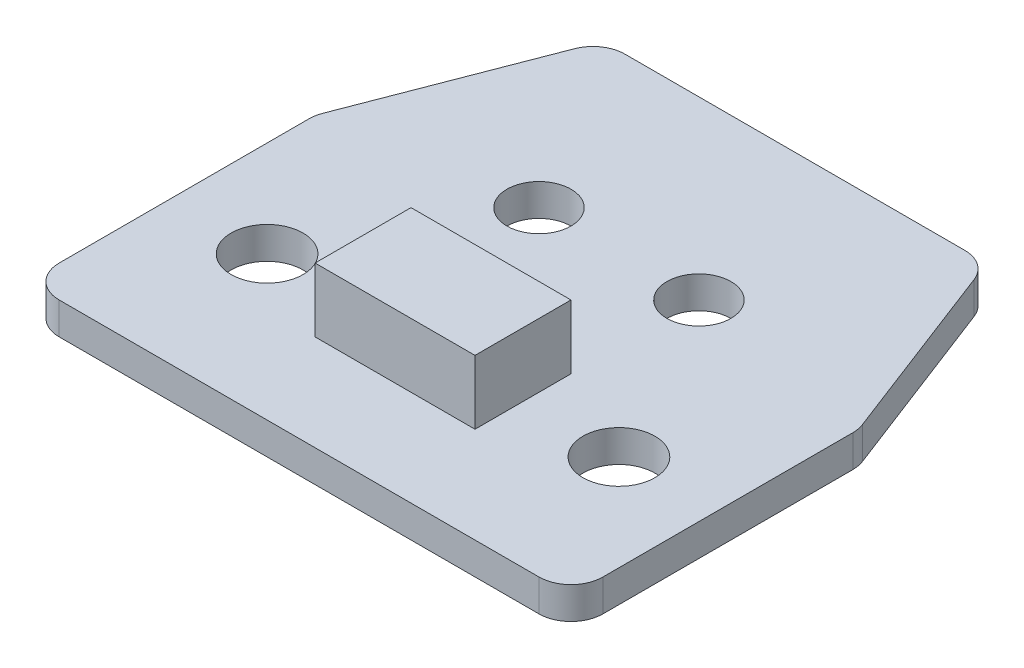
ISO-10303-21;
HEADER;
FILE_DESCRIPTION(('STEP AP214'),'2;1');
FILE_NAME('part.step','',(''),(''),'','','');
FILE_SCHEMA(('AUTOMOTIVE_DESIGN { 1 0 10303 214 1 1 1 1 }'));
ENDSEC;
DATA;
#1=APPLICATION_CONTEXT('core data for automotive mechanical design processes');
#2=APPLICATION_PROTOCOL_DEFINITION('international standard','automotive_design',2000,#1);
#3=PRODUCT_CONTEXT('',#1,'mechanical');
#4=PRODUCT('Part','Part','',(#3));
#5=PRODUCT_RELATED_PRODUCT_CATEGORY('part','',(#4));
#6=PRODUCT_DEFINITION_FORMATION('','',#4);
#7=PRODUCT_DEFINITION_CONTEXT('part definition',#1,'design');
#8=PRODUCT_DEFINITION('design','',#6,#7);
#9=PRODUCT_DEFINITION_SHAPE('','',#8);
#10=(LENGTH_UNIT() NAMED_UNIT(*) SI_UNIT(.MILLI.,.METRE.));
#11=(NAMED_UNIT(*) PLANE_ANGLE_UNIT() SI_UNIT($,.RADIAN.));
#12=(NAMED_UNIT(*) SI_UNIT($,.STERADIAN.) SOLID_ANGLE_UNIT());
#13=UNCERTAINTY_MEASURE_WITH_UNIT(LENGTH_MEASURE(1.E-05),#10,'distance_accuracy_value','');
#14=(GEOMETRIC_REPRESENTATION_CONTEXT(3) GLOBAL_UNCERTAINTY_ASSIGNED_CONTEXT((#13)) GLOBAL_UNIT_ASSIGNED_CONTEXT((#10,
#11,#12)) REPRESENTATION_CONTEXT('',''));
#15=CARTESIAN_POINT('',(0.,0.,0.));
#16=DIRECTION('',(0.,0.,1.));
#17=DIRECTION('',(1.,0.,0.));
#18=AXIS2_PLACEMENT_3D('',#15,#16,#17);
#19=CARTESIAN_POINT('',(0.,2.,0.));
#20=DIRECTION('',(0.,1.,0.));
#21=DIRECTION('',(0.,0.,1.));
#22=AXIS2_PLACEMENT_3D('',#19,#20,#21);
#23=PLANE('',#22);
#24=CARTESIAN_POINT('',(22.,2.,-20.));
#25=DIRECTION('',(0.,1.,0.));
#26=DIRECTION('',(0.,0.,1.));
#27=AXIS2_PLACEMENT_3D('',#24,#25,#26);
#28=CIRCLE('',#27,2.);
#29=CARTESIAN_POINT('',(22.,2.,-18.));
#30=VERTEX_POINT('',#29);
#31=EDGE_CURVE('E185',#30,#30,#28,.T.);
#32=ORIENTED_EDGE('',*,*,#31,.F.);
#33=EDGE_LOOP('',(#32));
#34=FACE_BOUND('',#33,.T.);
#35=CARTESIAN_POINT('',(12.,2.,-20.));
#36=DIRECTION('',(0.,1.,0.));
#37=DIRECTION('',(0.,0.,1.));
#38=AXIS2_PLACEMENT_3D('',#35,#36,#37);
#39=CIRCLE('',#38,2.);
#40=CARTESIAN_POINT('',(12.,2.,-18.));
#41=VERTEX_POINT('',#40);
#42=EDGE_CURVE('E188',#41,#41,#39,.T.);
#43=ORIENTED_EDGE('',*,*,#42,.F.);
#44=EDGE_LOOP('',(#43));
#45=FACE_BOUND('',#44,.T.);
#46=CARTESIAN_POINT('',(28.,2.,-9.));
#47=DIRECTION('',(0.,1.,0.));
#48=DIRECTION('',(0.,0.,1.));
#49=AXIS2_PLACEMENT_3D('',#46,#47,#48);
#50=CIRCLE('',#49,2.25);
#51=CARTESIAN_POINT('',(28.,2.,-6.75));
#52=VERTEX_POINT('',#51);
#53=EDGE_CURVE('E192',#52,#52,#50,.T.);
#54=ORIENTED_EDGE('',*,*,#53,.F.);
#55=EDGE_LOOP('',(#54));
#56=FACE_BOUND('',#55,.T.);
#57=CARTESIAN_POINT('',(6.,2.,-9.));
#58=DIRECTION('',(0.,1.,0.));
#59=DIRECTION('',(0.,0.,1.));
#60=AXIS2_PLACEMENT_3D('',#57,#58,#59);
#61=CIRCLE('',#60,2.25);
#62=CARTESIAN_POINT('',(6.,2.,-6.75));
#63=VERTEX_POINT('',#62);
#64=EDGE_CURVE('E195',#63,#63,#61,.T.);
#65=ORIENTED_EDGE('',*,*,#64,.F.);
#66=EDGE_LOOP('',(#65));
#67=FACE_BOUND('',#66,.T.);
#68=DIRECTION('',(1.,0.,0.));
#69=VECTOR('',#68,1.);
#70=CARTESIAN_POINT('',(0.,2.,-31.));
#71=LINE('',#70,#69);
#72=CARTESIAN_POINT('',(6.37359819648986,2.,-31.));
#73=VERTEX_POINT('',#72);
#74=CARTESIAN_POINT('',(27.6264018035101,2.,-31.));
#75=VERTEX_POINT('',#74);
#76=EDGE_CURVE('E201',#73,#75,#71,.T.);
#77=ORIENTED_EDGE('',*,*,#76,.F.);
#78=CARTESIAN_POINT('',(6.37359819648986,2.,-29.));
#79=DIRECTION('',(0.,1.,0.));
#80=DIRECTION('',(0.,0.,1.));
#81=AXIS2_PLACEMENT_3D('',#78,#79,#80);
#82=CIRCLE('',#81,2.);
#83=CARTESIAN_POINT('',(4.50690698408375,2.,-29.7179581586177));
#84=VERTEX_POINT('',#83);
#85=EDGE_CURVE('E269',#73,#84,#82,.T.);
#86=ORIENTED_EDGE('',*,*,#85,.T.);
#87=DIRECTION('',(0.358979079308869,0.,-0.93334560620306));
#88=VECTOR('',#87,1.);
#89=CARTESIAN_POINT('',(-6.03092783505155,2.,-2.31958762886598));
#90=LINE('',#89,#88);
#91=CARTESIAN_POINT('',(0.133308787593884,2.,-18.3466028477441));
#92=VERTEX_POINT('',#91);
#93=EDGE_CURVE('E204',#92,#84,#90,.T.);
#94=ORIENTED_EDGE('',*,*,#93,.F.);
#95=CARTESIAN_POINT('',(2.,2.,-17.6286446891264));
#96=DIRECTION('',(0.,1.,0.));
#97=DIRECTION('',(0.,0.,1.));
#98=AXIS2_PLACEMENT_3D('',#95,#96,#97);
#99=CIRCLE('',#98,2.);
#100=CARTESIAN_POINT('',(0.,2.,-17.6286446891264));
#101=VERTEX_POINT('',#100);
#102=EDGE_CURVE('E267',#92,#101,#99,.T.);
#103=ORIENTED_EDGE('',*,*,#102,.T.);
#104=DIRECTION('',(0.,0.,-1.));
#105=VECTOR('',#104,1.);
#106=CARTESIAN_POINT('',(0.,2.,0.));
#107=LINE('',#106,#105);
#108=CARTESIAN_POINT('',(0.,2.,-2.));
#109=VERTEX_POINT('',#108);
#110=EDGE_CURVE('E207',#109,#101,#107,.T.);
#111=ORIENTED_EDGE('',*,*,#110,.F.);
#112=CARTESIAN_POINT('',(2.,2.,-2.));
#113=DIRECTION('',(0.,1.,0.));
#114=DIRECTION('',(0.,0.,1.));
#115=AXIS2_PLACEMENT_3D('',#112,#113,#114);
#116=CIRCLE('',#115,2.);
#117=CARTESIAN_POINT('',(2.,2.,0.));
#118=VERTEX_POINT('',#117);
#119=EDGE_CURVE('E261',#109,#118,#116,.T.);
#120=ORIENTED_EDGE('',*,*,#119,.T.);
#121=DIRECTION('',(1.,0.,0.));
#122=VECTOR('',#121,1.);
#123=CARTESIAN_POINT('',(0.,2.,0.));
#124=LINE('',#123,#122);
#125=CARTESIAN_POINT('',(32.,2.,0.));
#126=VERTEX_POINT('',#125);
#127=EDGE_CURVE('E210',#118,#126,#124,.T.);
#128=ORIENTED_EDGE('',*,*,#127,.T.);
#129=CARTESIAN_POINT('',(32.,2.,-2.));
#130=DIRECTION('',(0.,1.,0.));
#131=DIRECTION('',(0.,0.,1.));
#132=AXIS2_PLACEMENT_3D('',#129,#130,#131);
#133=CIRCLE('',#132,2.);
#134=CARTESIAN_POINT('',(34.,2.,-2.));
#135=VERTEX_POINT('',#134);
#136=EDGE_CURVE('E58',#126,#135,#133,.T.);
#137=ORIENTED_EDGE('',*,*,#136,.T.);
#138=DIRECTION('',(0.,0.,-1.));
#139=VECTOR('',#138,1.);
#140=CARTESIAN_POINT('',(34.,2.,0.));
#141=LINE('',#140,#139);
#142=CARTESIAN_POINT('',(34.,2.,-17.6286446891264));
#143=VERTEX_POINT('',#142);
#144=EDGE_CURVE('E212',#135,#143,#141,.T.);
#145=ORIENTED_EDGE('',*,*,#144,.T.);
#146=CARTESIAN_POINT('',(32.,2.,-17.6286446891264));
#147=DIRECTION('',(0.,1.,0.));
#148=DIRECTION('',(0.,0.,1.));
#149=AXIS2_PLACEMENT_3D('',#146,#147,#148);
#150=CIRCLE('',#149,2.);
#151=CARTESIAN_POINT('',(33.8666912124061,2.,-18.3466028477441));
#152=VERTEX_POINT('',#151);
#153=EDGE_CURVE('E263',#143,#152,#150,.T.);
#154=ORIENTED_EDGE('',*,*,#153,.T.);
#155=DIRECTION('',(0.358979079308869,0.,0.93334560620306));
#156=VECTOR('',#155,1.);
#157=CARTESIAN_POINT('',(35.6494845360825,2.,-13.7113402061856));
#158=LINE('',#157,#156);
#159=CARTESIAN_POINT('',(29.4930930159163,2.,-29.7179581586177));
#160=VERTEX_POINT('',#159);
#161=EDGE_CURVE('E198',#160,#152,#158,.T.);
#162=ORIENTED_EDGE('',*,*,#161,.F.);
#163=CARTESIAN_POINT('',(27.6264018035101,2.,-29.));
#164=DIRECTION('',(0.,1.,0.));
#165=DIRECTION('',(0.,0.,1.));
#166=AXIS2_PLACEMENT_3D('',#163,#164,#165);
#167=CIRCLE('',#166,2.);
#168=EDGE_CURVE('E265',#160,#75,#167,.T.);
#169=ORIENTED_EDGE('',*,*,#168,.T.);
#170=EDGE_LOOP('',(#77,#86,#94,#103,#111,#120,#128,#137,#145,#154,#162,#169));
#171=FACE_BOUND('',#170,.T.);
#172=DIRECTION('',(1.,0.,0.));
#173=VECTOR('',#172,1.);
#174=CARTESIAN_POINT('',(12.,2.,-6.));
#175=LINE('',#174,#173);
#176=CARTESIAN_POINT('',(12.,2.,-6.));
#177=VERTEX_POINT('',#176);
#178=CARTESIAN_POINT('',(22.,2.,-6.));
#179=VERTEX_POINT('',#178);
#180=EDGE_CURVE('E542',#177,#179,#175,.T.);
#181=ORIENTED_EDGE('',*,*,#180,.F.);
#182=DIRECTION('',(0.,0.,1.));
#183=VECTOR('',#182,1.);
#184=CARTESIAN_POINT('',(12.,2.,-12.));
#185=LINE('',#184,#183);
#186=CARTESIAN_POINT('',(12.,2.,-12.));
#187=VERTEX_POINT('',#186);
#188=EDGE_CURVE('E174',#187,#177,#185,.T.);
#189=ORIENTED_EDGE('',*,*,#188,.F.);
#190=DIRECTION('',(-1.,0.,0.));
#191=VECTOR('',#190,1.);
#192=CARTESIAN_POINT('',(12.,2.,-12.));
#193=LINE('',#192,#191);
#194=CARTESIAN_POINT('',(22.,2.,-12.));
#195=VERTEX_POINT('',#194);
#196=EDGE_CURVE('E170',#195,#187,#193,.T.);
#197=ORIENTED_EDGE('',*,*,#196,.F.);
#198=DIRECTION('',(0.,0.,-1.));
#199=VECTOR('',#198,1.);
#200=CARTESIAN_POINT('',(22.,2.,-12.));
#201=LINE('',#200,#199);
#202=EDGE_CURVE('E540',#179,#195,#201,.T.);
#203=ORIENTED_EDGE('',*,*,#202,.F.);
#204=EDGE_LOOP('',(#181,#189,#197,#203));
#205=FACE_BOUND('',#204,.T.);
#206=ADVANCED_FACE('F36',(#34,#45,#56,#67,#171,#205),#23,.T.);
#207=CARTESIAN_POINT('',(35.6494845360825,2.,-13.7113402061856));
#208=DIRECTION('',(0.93334560620306,0.,-0.358979079308869));
#209=DIRECTION('',(-0.358979079308869,0.,-0.93334560620306));
#210=AXIS2_PLACEMENT_3D('',#207,#208,#209);
#211=PLANE('',#210);
#212=DIRECTION('',(0.358979079308869,0.,0.93334560620306));
#213=VECTOR('',#212,1.);
#214=CARTESIAN_POINT('',(35.6494845360825,0.,-13.7113402061856));
#215=LINE('',#214,#213);
#216=CARTESIAN_POINT('',(29.4930930159163,0.,-29.7179581586177));
#217=VERTEX_POINT('',#216);
#218=CARTESIAN_POINT('',(33.8666912124061,0.,-18.3466028477441));
#219=VERTEX_POINT('',#218);
#220=EDGE_CURVE('E223',#217,#219,#215,.T.);
#221=ORIENTED_EDGE('',*,*,#220,.F.);
#222=DIRECTION('',(0.,-1.,0.));
#223=VECTOR('',#222,1.);
#224=CARTESIAN_POINT('',(29.4930930159163,2.,-29.7179581586177));
#225=LINE('',#224,#223);
#226=EDGE_CURVE('E279',#217,#160,#225,.F.);
#227=ORIENTED_EDGE('',*,*,#226,.T.);
#228=ORIENTED_EDGE('',*,*,#161,.T.);
#229=DIRECTION('',(0.,-1.,0.));
#230=VECTOR('',#229,1.);
#231=CARTESIAN_POINT('',(33.8666912124061,0.,-18.3466028477441));
#232=LINE('',#231,#230);
#233=EDGE_CURVE('E276',#152,#219,#232,.T.);
#234=ORIENTED_EDGE('',*,*,#233,.T.);
#235=EDGE_LOOP('',(#221,#227,#228,#234));
#236=FACE_BOUND('',#235,.T.);
#237=ADVANCED_FACE('F306',(#236),#211,.T.);
#238=CARTESIAN_POINT('',(0.,2.,-31.));
#239=DIRECTION('',(0.,0.,-1.));
#240=DIRECTION('',(-1.,0.,0.));
#241=AXIS2_PLACEMENT_3D('',#238,#239,#240);
#242=PLANE('',#241);
#243=DIRECTION('',(1.,0.,0.));
#244=VECTOR('',#243,1.);
#245=CARTESIAN_POINT('',(0.,0.,-31.));
#246=LINE('',#245,#244);
#247=CARTESIAN_POINT('',(6.37359819648986,0.,-31.));
#248=VERTEX_POINT('',#247);
#249=CARTESIAN_POINT('',(27.6264018035101,0.,-31.));
#250=VERTEX_POINT('',#249);
#251=EDGE_CURVE('E226',#248,#250,#246,.T.);
#252=ORIENTED_EDGE('',*,*,#251,.F.);
#253=DIRECTION('',(0.,-1.,0.));
#254=VECTOR('',#253,1.);
#255=CARTESIAN_POINT('',(6.37359819648986,2.,-31.));
#256=LINE('',#255,#254);
#257=EDGE_CURVE('E258',#248,#73,#256,.F.);
#258=ORIENTED_EDGE('',*,*,#257,.T.);
#259=ORIENTED_EDGE('',*,*,#76,.T.);
#260=DIRECTION('',(0.,-1.,0.));
#261=VECTOR('',#260,1.);
#262=CARTESIAN_POINT('',(27.6264018035101,2.,-31.));
#263=LINE('',#262,#261);
#264=EDGE_CURVE('E255',#75,#250,#263,.T.);
#265=ORIENTED_EDGE('',*,*,#264,.T.);
#266=EDGE_LOOP('',(#252,#258,#259,#265));
#267=FACE_BOUND('',#266,.T.);
#268=ADVANCED_FACE('F315',(#267),#242,.T.);
#269=CARTESIAN_POINT('',(-6.03092783505155,2.,-2.31958762886598));
#270=DIRECTION('',(-0.93334560620306,0.,-0.358979079308869));
#271=DIRECTION('',(-0.358979079308869,0.,0.93334560620306));
#272=AXIS2_PLACEMENT_3D('',#269,#270,#271);
#273=PLANE('',#272);
#274=ORIENTED_EDGE('',*,*,#93,.T.);
#275=DIRECTION('',(0.,-1.,0.));
#276=VECTOR('',#275,1.);
#277=CARTESIAN_POINT('',(4.50690698408374,2.,-29.7179581586177));
#278=LINE('',#277,#276);
#279=CARTESIAN_POINT('',(4.50690698408375,0.,-29.7179581586177));
#280=VERTEX_POINT('',#279);
#281=EDGE_CURVE('E240',#84,#280,#278,.T.);
#282=ORIENTED_EDGE('',*,*,#281,.T.);
#283=DIRECTION('',(0.358979079308869,0.,-0.93334560620306));
#284=VECTOR('',#283,1.);
#285=CARTESIAN_POINT('',(-6.03092783505155,0.,-2.31958762886598));
#286=LINE('',#285,#284);
#287=CARTESIAN_POINT('',(0.133308787593884,0.,-18.3466028477441));
#288=VERTEX_POINT('',#287);
#289=EDGE_CURVE('E229',#288,#280,#286,.T.);
#290=ORIENTED_EDGE('',*,*,#289,.F.);
#291=DIRECTION('',(0.,-1.,0.));
#292=VECTOR('',#291,1.);
#293=CARTESIAN_POINT('',(0.133308787593883,2.,-18.3466028477441));
#294=LINE('',#293,#292);
#295=EDGE_CURVE('E213',#288,#92,#294,.F.);
#296=ORIENTED_EDGE('',*,*,#295,.T.);
#297=EDGE_LOOP('',(#274,#282,#290,#296));
#298=FACE_BOUND('',#297,.T.);
#299=ADVANCED_FACE('F323',(#298),#273,.T.);
#300=CARTESIAN_POINT('',(0.,2.,0.));
#301=DIRECTION('',(-1.,0.,0.));
#302=DIRECTION('',(0.,0.,1.));
#303=AXIS2_PLACEMENT_3D('',#300,#301,#302);
#304=PLANE('',#303);
#305=ORIENTED_EDGE('',*,*,#110,.T.);
#306=DIRECTION('',(0.,-1.,0.));
#307=VECTOR('',#306,1.);
#308=CARTESIAN_POINT('',(0.,2.,-17.6286446891264));
#309=LINE('',#308,#307);
#310=CARTESIAN_POINT('',(0.,0.,-17.6286446891264));
#311=VERTEX_POINT('',#310);
#312=EDGE_CURVE('E273',#101,#311,#309,.T.);
#313=ORIENTED_EDGE('',*,*,#312,.T.);
#314=DIRECTION('',(0.,0.,-1.));
#315=VECTOR('',#314,1.);
#316=CARTESIAN_POINT('',(0.,0.,0.));
#317=LINE('',#316,#315);
#318=CARTESIAN_POINT('',(0.,0.,-2.));
#319=VERTEX_POINT('',#318);
#320=EDGE_CURVE('E232',#319,#311,#317,.T.);
#321=ORIENTED_EDGE('',*,*,#320,.F.);
#322=DIRECTION('',(0.,-1.,0.));
#323=VECTOR('',#322,1.);
#324=CARTESIAN_POINT('',(0.,2.,-2.));
#325=LINE('',#324,#323);
#326=EDGE_CURVE('E271',#319,#109,#325,.F.);
#327=ORIENTED_EDGE('',*,*,#326,.T.);
#328=EDGE_LOOP('',(#305,#313,#321,#327));
#329=FACE_BOUND('',#328,.T.);
#330=ADVANCED_FACE('F332',(#329),#304,.T.);
#331=CARTESIAN_POINT('',(0.,2.,0.));
#332=DIRECTION('',(0.,0.,-1.));
#333=DIRECTION('',(-1.,0.,0.));
#334=AXIS2_PLACEMENT_3D('',#331,#332,#333);
#335=PLANE('',#334);
#336=ORIENTED_EDGE('',*,*,#127,.F.);
#337=DIRECTION('',(0.,-1.,0.));
#338=VECTOR('',#337,1.);
#339=CARTESIAN_POINT('',(2.,0.,0.));
#340=LINE('',#339,#338);
#341=CARTESIAN_POINT('',(2.,0.,0.));
#342=VERTEX_POINT('',#341);
#343=EDGE_CURVE('E11',#118,#342,#340,.T.);
#344=ORIENTED_EDGE('',*,*,#343,.T.);
#345=DIRECTION('',(1.,0.,0.));
#346=VECTOR('',#345,1.);
#347=CARTESIAN_POINT('',(0.,0.,0.));
#348=LINE('',#347,#346);
#349=CARTESIAN_POINT('',(32.,0.,0.));
#350=VERTEX_POINT('',#349);
#351=EDGE_CURVE('E235',#342,#350,#348,.T.);
#352=ORIENTED_EDGE('',*,*,#351,.T.);
#353=DIRECTION('',(0.,-1.,0.));
#354=VECTOR('',#353,1.);
#355=CARTESIAN_POINT('',(32.,2.,0.));
#356=LINE('',#355,#354);
#357=EDGE_CURVE('E44',#350,#126,#356,.F.);
#358=ORIENTED_EDGE('',*,*,#357,.T.);
#359=EDGE_LOOP('',(#336,#344,#352,#358));
#360=FACE_BOUND('',#359,.T.);
#361=ADVANCED_FACE('F287',(#360),#335,.F.);
#362=CARTESIAN_POINT('',(6.,2.,-9.));
#363=DIRECTION('',(0.,-1.,0.));
#364=DIRECTION('',(0.,0.,-1.));
#365=AXIS2_PLACEMENT_3D('',#362,#363,#364);
#366=CYLINDRICAL_SURFACE('',#365,2.25);
#367=ORIENTED_EDGE('',*,*,#64,.T.);
#368=EDGE_LOOP('',(#367));
#369=FACE_BOUND('',#368,.T.);
#370=CARTESIAN_POINT('',(6.,0.,-9.));
#371=DIRECTION('',(0.,1.,0.));
#372=DIRECTION('',(0.,0.,1.));
#373=AXIS2_PLACEMENT_3D('',#370,#371,#372);
#374=CIRCLE('',#373,2.25);
#375=CARTESIAN_POINT('',(6.,0.,-6.75));
#376=VERTEX_POINT('',#375);
#377=EDGE_CURVE('E220',#376,#376,#374,.T.);
#378=ORIENTED_EDGE('',*,*,#377,.F.);
#379=EDGE_LOOP('',(#378));
#380=FACE_BOUND('',#379,.T.);
#381=ADVANCED_FACE('F362',(#369,#380),#366,.F.);
#382=CARTESIAN_POINT('',(28.,2.,-9.));
#383=DIRECTION('',(0.,-1.,0.));
#384=DIRECTION('',(0.,0.,-1.));
#385=AXIS2_PLACEMENT_3D('',#382,#383,#384);
#386=CYLINDRICAL_SURFACE('',#385,2.25);
#387=ORIENTED_EDGE('',*,*,#53,.T.);
#388=EDGE_LOOP('',(#387));
#389=FACE_BOUND('',#388,.T.);
#390=CARTESIAN_POINT('',(28.,0.,-9.));
#391=DIRECTION('',(0.,1.,0.));
#392=DIRECTION('',(0.,0.,1.));
#393=AXIS2_PLACEMENT_3D('',#390,#391,#392);
#394=CIRCLE('',#393,2.25);
#395=CARTESIAN_POINT('',(28.,0.,-6.75));
#396=VERTEX_POINT('',#395);
#397=EDGE_CURVE('E217',#396,#396,#394,.T.);
#398=ORIENTED_EDGE('',*,*,#397,.F.);
#399=EDGE_LOOP('',(#398));
#400=FACE_BOUND('',#399,.T.);
#401=ADVANCED_FACE('F371',(#389,#400),#386,.F.);
#402=CARTESIAN_POINT('',(12.,2.,-20.));
#403=DIRECTION('',(0.,-1.,0.));
#404=DIRECTION('',(0.,0.,-1.));
#405=AXIS2_PLACEMENT_3D('',#402,#403,#404);
#406=CYLINDRICAL_SURFACE('',#405,2.);
#407=ORIENTED_EDGE('',*,*,#42,.T.);
#408=EDGE_LOOP('',(#407));
#409=FACE_BOUND('',#408,.T.);
#410=CARTESIAN_POINT('',(12.,0.,-20.));
#411=DIRECTION('',(0.,1.,0.));
#412=DIRECTION('',(0.,0.,1.));
#413=AXIS2_PLACEMENT_3D('',#410,#411,#412);
#414=CIRCLE('',#413,2.);
#415=CARTESIAN_POINT('',(12.,0.,-18.));
#416=VERTEX_POINT('',#415);
#417=EDGE_CURVE('E179',#416,#416,#414,.T.);
#418=ORIENTED_EDGE('',*,*,#417,.F.);
#419=EDGE_LOOP('',(#418));
#420=FACE_BOUND('',#419,.T.);
#421=ADVANCED_FACE('F375',(#409,#420),#406,.F.);
#422=CARTESIAN_POINT('',(22.,2.,-20.));
#423=DIRECTION('',(0.,-1.,0.));
#424=DIRECTION('',(0.,0.,-1.));
#425=AXIS2_PLACEMENT_3D('',#422,#423,#424);
#426=CYLINDRICAL_SURFACE('',#425,2.);
#427=ORIENTED_EDGE('',*,*,#31,.T.);
#428=EDGE_LOOP('',(#427));
#429=FACE_BOUND('',#428,.T.);
#430=CARTESIAN_POINT('',(22.,0.,-20.));
#431=DIRECTION('',(0.,1.,0.));
#432=DIRECTION('',(0.,0.,1.));
#433=AXIS2_PLACEMENT_3D('',#430,#431,#432);
#434=CIRCLE('',#433,2.);
#435=CARTESIAN_POINT('',(22.,0.,-18.));
#436=VERTEX_POINT('',#435);
#437=EDGE_CURVE('E176',#436,#436,#434,.T.);
#438=ORIENTED_EDGE('',*,*,#437,.F.);
#439=EDGE_LOOP('',(#438));
#440=FACE_BOUND('',#439,.T.);
#441=ADVANCED_FACE('F359',(#429,#440),#426,.F.);
#442=CARTESIAN_POINT('',(34.,2.,0.));
#443=DIRECTION('',(-1.,0.,0.));
#444=DIRECTION('',(0.,0.,1.));
#445=AXIS2_PLACEMENT_3D('',#442,#443,#444);
#446=PLANE('',#445);
#447=DIRECTION('',(0.,0.,-1.));
#448=VECTOR('',#447,1.);
#449=CARTESIAN_POINT('',(34.,0.,0.));
#450=LINE('',#449,#448);
#451=CARTESIAN_POINT('',(34.,0.,-2.));
#452=VERTEX_POINT('',#451);
#453=CARTESIAN_POINT('',(34.,0.,-17.6286446891264));
#454=VERTEX_POINT('',#453);
#455=EDGE_CURVE('E189',#452,#454,#450,.T.);
#456=ORIENTED_EDGE('',*,*,#455,.T.);
#457=DIRECTION('',(0.,-1.,0.));
#458=VECTOR('',#457,1.);
#459=CARTESIAN_POINT('',(34.,2.,-17.6286446891264));
#460=LINE('',#459,#458);
#461=EDGE_CURVE('E51',#454,#143,#460,.F.);
#462=ORIENTED_EDGE('',*,*,#461,.T.);
#463=ORIENTED_EDGE('',*,*,#144,.F.);
#464=DIRECTION('',(0.,-1.,0.));
#465=VECTOR('',#464,1.);
#466=CARTESIAN_POINT('',(34.,2.,-2.));
#467=LINE('',#466,#465);
#468=EDGE_CURVE('E281',#135,#452,#467,.T.);
#469=ORIENTED_EDGE('',*,*,#468,.T.);
#470=EDGE_LOOP('',(#456,#462,#463,#469));
#471=FACE_BOUND('',#470,.T.);
#472=ADVANCED_FACE('F297',(#471),#446,.F.);
#473=CARTESIAN_POINT('',(0.,0.,0.));
#474=DIRECTION('',(0.,1.,0.));
#475=DIRECTION('',(0.,0.,1.));
#476=AXIS2_PLACEMENT_3D('',#473,#474,#475);
#477=PLANE('',#476);
#478=ORIENTED_EDGE('',*,*,#437,.T.);
#479=EDGE_LOOP('',(#478));
#480=FACE_BOUND('',#479,.T.);
#481=ORIENTED_EDGE('',*,*,#417,.T.);
#482=EDGE_LOOP('',(#481));
#483=FACE_BOUND('',#482,.T.);
#484=ORIENTED_EDGE('',*,*,#397,.T.);
#485=EDGE_LOOP('',(#484));
#486=FACE_BOUND('',#485,.T.);
#487=ORIENTED_EDGE('',*,*,#377,.T.);
#488=EDGE_LOOP('',(#487));
#489=FACE_BOUND('',#488,.T.);
#490=ORIENTED_EDGE('',*,*,#289,.T.);
#491=CARTESIAN_POINT('',(6.37359819648986,0.,-29.));
#492=DIRECTION('',(0.,1.,0.));
#493=DIRECTION('',(0.,0.,1.));
#494=AXIS2_PLACEMENT_3D('',#491,#492,#493);
#495=CIRCLE('',#494,2.);
#496=EDGE_CURVE('E253',#280,#248,#495,.F.);
#497=ORIENTED_EDGE('',*,*,#496,.T.);
#498=ORIENTED_EDGE('',*,*,#251,.T.);
#499=CARTESIAN_POINT('',(27.6264018035101,0.,-29.));
#500=DIRECTION('',(0.,1.,0.));
#501=DIRECTION('',(0.,0.,1.));
#502=AXIS2_PLACEMENT_3D('',#499,#500,#501);
#503=CIRCLE('',#502,2.);
#504=EDGE_CURVE('E249',#250,#217,#503,.F.);
#505=ORIENTED_EDGE('',*,*,#504,.T.);
#506=ORIENTED_EDGE('',*,*,#220,.T.);
#507=CARTESIAN_POINT('',(32.,0.,-17.6286446891264));
#508=DIRECTION('',(0.,1.,0.));
#509=DIRECTION('',(0.,0.,1.));
#510=AXIS2_PLACEMENT_3D('',#507,#508,#509);
#511=CIRCLE('',#510,2.);
#512=EDGE_CURVE('E247',#219,#454,#511,.F.);
#513=ORIENTED_EDGE('',*,*,#512,.T.);
#514=ORIENTED_EDGE('',*,*,#455,.F.);
#515=CARTESIAN_POINT('',(32.,0.,-2.));
#516=DIRECTION('',(0.,1.,0.));
#517=DIRECTION('',(0.,0.,1.));
#518=AXIS2_PLACEMENT_3D('',#515,#516,#517);
#519=CIRCLE('',#518,2.);
#520=EDGE_CURVE('E243',#452,#350,#519,.F.);
#521=ORIENTED_EDGE('',*,*,#520,.T.);
#522=ORIENTED_EDGE('',*,*,#351,.F.);
#523=CARTESIAN_POINT('',(2.,0.,-2.));
#524=DIRECTION('',(0.,1.,0.));
#525=DIRECTION('',(0.,0.,1.));
#526=AXIS2_PLACEMENT_3D('',#523,#524,#525);
#527=CIRCLE('',#526,2.);
#528=EDGE_CURVE('E245',#342,#319,#527,.F.);
#529=ORIENTED_EDGE('',*,*,#528,.T.);
#530=ORIENTED_EDGE('',*,*,#320,.T.);
#531=CARTESIAN_POINT('',(2.,0.,-17.6286446891264));
#532=DIRECTION('',(0.,1.,0.));
#533=DIRECTION('',(0.,0.,1.));
#534=AXIS2_PLACEMENT_3D('',#531,#532,#533);
#535=CIRCLE('',#534,2.);
#536=EDGE_CURVE('E251',#311,#288,#535,.F.);
#537=ORIENTED_EDGE('',*,*,#536,.T.);
#538=EDGE_LOOP('',(#490,#497,#498,#505,#506,#513,#514,#521,#522,#529,#530,#537));
#539=FACE_BOUND('',#538,.T.);
#540=ADVANCED_FACE('F299',(#480,#483,#486,#489,#539),#477,.F.);
#541=CARTESIAN_POINT('',(12.,6.,-12.));
#542=DIRECTION('',(1.,0.,0.));
#543=DIRECTION('',(0.,0.,-1.));
#544=AXIS2_PLACEMENT_3D('',#541,#542,#543);
#545=PLANE('',#544);
#546=ORIENTED_EDGE('',*,*,#188,.T.);
#547=DIRECTION('',(0.,-1.,0.));
#548=VECTOR('',#547,1.);
#549=CARTESIAN_POINT('',(12.,6.,-6.));
#550=LINE('',#549,#548);
#551=CARTESIAN_POINT('',(12.,6.,-6.));
#552=VERTEX_POINT('',#551);
#553=EDGE_CURVE('E154',#552,#177,#550,.T.);
#554=ORIENTED_EDGE('',*,*,#553,.F.);
#555=DIRECTION('',(0.,0.,1.));
#556=VECTOR('',#555,1.);
#557=CARTESIAN_POINT('',(12.,6.,-12.));
#558=LINE('',#557,#556);
#559=CARTESIAN_POINT('',(12.,6.,-12.));
#560=VERTEX_POINT('',#559);
#561=EDGE_CURVE('E161',#560,#552,#558,.T.);
#562=ORIENTED_EDGE('',*,*,#561,.F.);
#563=DIRECTION('',(0.,-1.,0.));
#564=VECTOR('',#563,1.);
#565=CARTESIAN_POINT('',(12.,6.,-12.));
#566=LINE('',#565,#564);
#567=EDGE_CURVE('E547',#560,#187,#566,.T.);
#568=ORIENTED_EDGE('',*,*,#567,.T.);
#569=EDGE_LOOP('',(#546,#554,#562,#568));
#570=FACE_BOUND('',#569,.T.);
#571=ADVANCED_FACE('F172',(#570),#545,.F.);
#572=CARTESIAN_POINT('',(12.,6.,-6.));
#573=DIRECTION('',(0.,0.,-1.));
#574=DIRECTION('',(-1.,0.,0.));
#575=AXIS2_PLACEMENT_3D('',#572,#573,#574);
#576=PLANE('',#575);
#577=ORIENTED_EDGE('',*,*,#180,.T.);
#578=DIRECTION('',(0.,-1.,0.));
#579=VECTOR('',#578,1.);
#580=CARTESIAN_POINT('',(22.,6.,-6.));
#581=LINE('',#580,#579);
#582=CARTESIAN_POINT('',(22.,6.,-6.));
#583=VERTEX_POINT('',#582);
#584=EDGE_CURVE('E157',#583,#179,#581,.T.);
#585=ORIENTED_EDGE('',*,*,#584,.F.);
#586=DIRECTION('',(1.,0.,0.));
#587=VECTOR('',#586,1.);
#588=CARTESIAN_POINT('',(12.,6.,-6.));
#589=LINE('',#588,#587);
#590=EDGE_CURVE('E150',#552,#583,#589,.T.);
#591=ORIENTED_EDGE('',*,*,#590,.F.);
#592=ORIENTED_EDGE('',*,*,#553,.T.);
#593=EDGE_LOOP('',(#577,#585,#591,#592));
#594=FACE_BOUND('',#593,.T.);
#595=ADVANCED_FACE('F152',(#594),#576,.F.);
#596=CARTESIAN_POINT('',(22.,6.,-12.));
#597=DIRECTION('',(-1.,0.,0.));
#598=DIRECTION('',(0.,0.,1.));
#599=AXIS2_PLACEMENT_3D('',#596,#597,#598);
#600=PLANE('',#599);
#601=ORIENTED_EDGE('',*,*,#202,.T.);
#602=DIRECTION('',(0.,-1.,0.));
#603=VECTOR('',#602,1.);
#604=CARTESIAN_POINT('',(22.,6.,-12.));
#605=LINE('',#604,#603);
#606=CARTESIAN_POINT('',(22.,6.,-12.));
#607=VERTEX_POINT('',#606);
#608=EDGE_CURVE('E181',#607,#195,#605,.T.);
#609=ORIENTED_EDGE('',*,*,#608,.F.);
#610=DIRECTION('',(0.,0.,-1.));
#611=VECTOR('',#610,1.);
#612=CARTESIAN_POINT('',(22.,6.,-12.));
#613=LINE('',#612,#611);
#614=EDGE_CURVE('E160',#583,#607,#613,.T.);
#615=ORIENTED_EDGE('',*,*,#614,.F.);
#616=ORIENTED_EDGE('',*,*,#584,.T.);
#617=EDGE_LOOP('',(#601,#609,#615,#616));
#618=FACE_BOUND('',#617,.T.);
#619=ADVANCED_FACE('F436',(#618),#600,.F.);
#620=CARTESIAN_POINT('',(12.,6.,-12.));
#621=DIRECTION('',(0.,0.,1.));
#622=DIRECTION('',(1.,0.,0.));
#623=AXIS2_PLACEMENT_3D('',#620,#621,#622);
#624=PLANE('',#623);
#625=ORIENTED_EDGE('',*,*,#196,.T.);
#626=ORIENTED_EDGE('',*,*,#567,.F.);
#627=DIRECTION('',(-1.,0.,0.));
#628=VECTOR('',#627,1.);
#629=CARTESIAN_POINT('',(12.,6.,-12.));
#630=LINE('',#629,#628);
#631=EDGE_CURVE('E166',#607,#560,#630,.T.);
#632=ORIENTED_EDGE('',*,*,#631,.F.);
#633=ORIENTED_EDGE('',*,*,#608,.T.);
#634=EDGE_LOOP('',(#625,#626,#632,#633));
#635=FACE_BOUND('',#634,.T.);
#636=ADVANCED_FACE('F428',(#635),#624,.F.);
#637=CARTESIAN_POINT('',(0.,6.,0.));
#638=DIRECTION('',(0.,1.,0.));
#639=DIRECTION('',(0.,0.,1.));
#640=AXIS2_PLACEMENT_3D('',#637,#638,#639);
#641=PLANE('',#640);
#642=ORIENTED_EDGE('',*,*,#561,.T.);
#643=ORIENTED_EDGE('',*,*,#590,.T.);
#644=ORIENTED_EDGE('',*,*,#614,.T.);
#645=ORIENTED_EDGE('',*,*,#631,.T.);
#646=EDGE_LOOP('',(#642,#643,#644,#645));
#647=FACE_BOUND('',#646,.T.);
#648=ADVANCED_FACE('F164',(#647),#641,.T.);
#649=CARTESIAN_POINT('',(6.37359819648986,2.,-29.));
#650=DIRECTION('',(0.,-1.,0.));
#651=DIRECTION('',(0.,0.,-1.));
#652=AXIS2_PLACEMENT_3D('',#649,#650,#651);
#653=CYLINDRICAL_SURFACE('',#652,2.);
#654=ORIENTED_EDGE('',*,*,#85,.F.);
#655=ORIENTED_EDGE('',*,*,#257,.F.);
#656=ORIENTED_EDGE('',*,*,#496,.F.);
#657=ORIENTED_EDGE('',*,*,#281,.F.);
#658=EDGE_LOOP('',(#654,#655,#656,#657));
#659=FACE_BOUND('',#658,.T.);
#660=ADVANCED_FACE('F321',(#659),#653,.T.);
#661=CARTESIAN_POINT('',(2.,2.,-17.6286446891264));
#662=DIRECTION('',(0.,-1.,0.));
#663=DIRECTION('',(0.,0.,-1.));
#664=AXIS2_PLACEMENT_3D('',#661,#662,#663);
#665=CYLINDRICAL_SURFACE('',#664,2.);
#666=ORIENTED_EDGE('',*,*,#102,.F.);
#667=ORIENTED_EDGE('',*,*,#295,.F.);
#668=ORIENTED_EDGE('',*,*,#536,.F.);
#669=ORIENTED_EDGE('',*,*,#312,.F.);
#670=EDGE_LOOP('',(#666,#667,#668,#669));
#671=FACE_BOUND('',#670,.T.);
#672=ADVANCED_FACE('F329',(#671),#665,.T.);
#673=CARTESIAN_POINT('',(27.6264018035101,2.,-29.));
#674=DIRECTION('',(0.,-1.,0.));
#675=DIRECTION('',(0.,0.,-1.));
#676=AXIS2_PLACEMENT_3D('',#673,#674,#675);
#677=CYLINDRICAL_SURFACE('',#676,2.);
#678=ORIENTED_EDGE('',*,*,#168,.F.);
#679=ORIENTED_EDGE('',*,*,#226,.F.);
#680=ORIENTED_EDGE('',*,*,#504,.F.);
#681=ORIENTED_EDGE('',*,*,#264,.F.);
#682=EDGE_LOOP('',(#678,#679,#680,#681));
#683=FACE_BOUND('',#682,.T.);
#684=ADVANCED_FACE('F312',(#683),#677,.T.);
#685=CARTESIAN_POINT('',(32.,2.,-17.6286446891264));
#686=DIRECTION('',(0.,1.,0.));
#687=DIRECTION('',(0.,0.,1.));
#688=AXIS2_PLACEMENT_3D('',#685,#686,#687);
#689=CYLINDRICAL_SURFACE('',#688,2.);
#690=ORIENTED_EDGE('',*,*,#153,.F.);
#691=ORIENTED_EDGE('',*,*,#461,.F.);
#692=ORIENTED_EDGE('',*,*,#512,.F.);
#693=ORIENTED_EDGE('',*,*,#233,.F.);
#694=EDGE_LOOP('',(#690,#691,#692,#693));
#695=FACE_BOUND('',#694,.T.);
#696=ADVANCED_FACE('F304',(#695),#689,.T.);
#697=CARTESIAN_POINT('',(2.,2.,-2.));
#698=DIRECTION('',(0.,1.,0.));
#699=DIRECTION('',(0.,0.,1.));
#700=AXIS2_PLACEMENT_3D('',#697,#698,#699);
#701=CYLINDRICAL_SURFACE('',#700,2.);
#702=ORIENTED_EDGE('',*,*,#119,.F.);
#703=ORIENTED_EDGE('',*,*,#326,.F.);
#704=ORIENTED_EDGE('',*,*,#528,.F.);
#705=ORIENTED_EDGE('',*,*,#343,.F.);
#706=EDGE_LOOP('',(#702,#703,#704,#705));
#707=FACE_BOUND('',#706,.T.);
#708=ADVANCED_FACE('F335',(#707),#701,.T.);
#709=CARTESIAN_POINT('',(32.,2.,-2.));
#710=DIRECTION('',(0.,-1.,0.));
#711=DIRECTION('',(0.,0.,-1.));
#712=AXIS2_PLACEMENT_3D('',#709,#710,#711);
#713=CYLINDRICAL_SURFACE('',#712,2.);
#714=ORIENTED_EDGE('',*,*,#136,.F.);
#715=ORIENTED_EDGE('',*,*,#357,.F.);
#716=ORIENTED_EDGE('',*,*,#520,.F.);
#717=ORIENTED_EDGE('',*,*,#468,.F.);
#718=EDGE_LOOP('',(#714,#715,#716,#717));
#719=FACE_BOUND('',#718,.T.);
#720=ADVANCED_FACE('F38',(#719),#713,.T.);
#721=CLOSED_SHELL('',(#206,#237,#268,#299,#330,#361,#381,#401,#421,#441,#472,#540,#571,#595,
#619,#636,#648,#660,#672,#684,#696,#708,#720));
#722=MANIFOLD_SOLID_BREP('B2',#721);
#723=ADVANCED_BREP_SHAPE_REPRESENTATION('',(#18,#722),#14);
#724=SHAPE_DEFINITION_REPRESENTATION(#9,#723);
ENDSEC;
END-ISO-10303-21;
